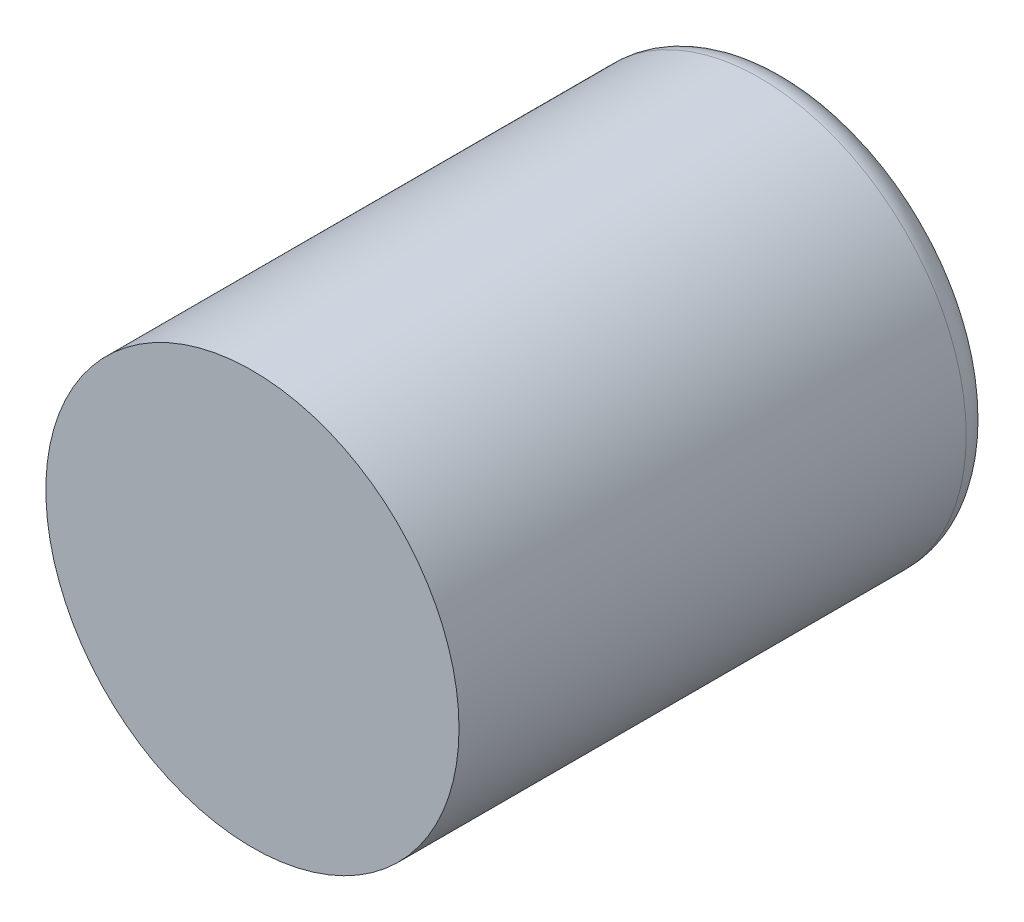
ISO-10303-21;
HEADER;
FILE_DESCRIPTION(('STEP AP214'),'2;1');
FILE_NAME('part.step','',(''),(''),'','','');
FILE_SCHEMA(('AUTOMOTIVE_DESIGN { 1 0 10303 214 1 1 1 1 }'));
ENDSEC;
DATA;
#1=APPLICATION_CONTEXT('core data for automotive mechanical design processes');
#2=APPLICATION_PROTOCOL_DEFINITION('international standard','automotive_design',2000,#1);
#3=PRODUCT_CONTEXT('',#1,'mechanical');
#4=PRODUCT('Part','Part','',(#3));
#5=PRODUCT_RELATED_PRODUCT_CATEGORY('part','',(#4));
#6=PRODUCT_DEFINITION_FORMATION('','',#4);
#7=PRODUCT_DEFINITION_CONTEXT('part definition',#1,'design');
#8=PRODUCT_DEFINITION('design','',#6,#7);
#9=PRODUCT_DEFINITION_SHAPE('','',#8);
#10=(LENGTH_UNIT() NAMED_UNIT(*) SI_UNIT(.MILLI.,.METRE.));
#11=(NAMED_UNIT(*) PLANE_ANGLE_UNIT() SI_UNIT($,.RADIAN.));
#12=(NAMED_UNIT(*) SI_UNIT($,.STERADIAN.) SOLID_ANGLE_UNIT());
#13=UNCERTAINTY_MEASURE_WITH_UNIT(LENGTH_MEASURE(1.E-05),#10,'distance_accuracy_value','');
#14=(GEOMETRIC_REPRESENTATION_CONTEXT(3) GLOBAL_UNCERTAINTY_ASSIGNED_CONTEXT((#13)) GLOBAL_UNIT_ASSIGNED_CONTEXT((#10,
#11,#12)) REPRESENTATION_CONTEXT('',''));
#15=CARTESIAN_POINT('',(0.,0.,0.));
#16=DIRECTION('',(0.,0.,1.));
#17=DIRECTION('',(1.,0.,0.));
#18=AXIS2_PLACEMENT_3D('',#15,#16,#17);
#19=CARTESIAN_POINT('',(0.,0.,0.2));
#20=DIRECTION('',(0.,0.,1.));
#21=DIRECTION('',(1.,0.,0.));
#22=AXIS2_PLACEMENT_3D('',#19,#20,#21);
#23=PLANE('',#22);
#24=CARTESIAN_POINT('',(0.,0.,0.2));
#25=DIRECTION('',(0.,0.,1.));
#26=DIRECTION('',(1.,0.,0.));
#27=AXIS2_PLACEMENT_3D('',#24,#25,#26);
#28=CIRCLE('',#27,6.25);
#29=CARTESIAN_POINT('',(6.25,0.,0.2));
#30=VERTEX_POINT('',#29);
#31=EDGE_CURVE('E27',#30,#30,#28,.T.);
#32=ORIENTED_EDGE('',*,*,#31,.F.);
#33=EDGE_LOOP('',(#32));
#34=FACE_BOUND('',#33,.T.);
#35=ADVANCED_FACE('F15',(#34),#23,.F.);
#36=CARTESIAN_POINT('',(0.,0.,19.));
#37=DIRECTION('',(0.,0.,1.));
#38=DIRECTION('',(1.,0.,0.));
#39=AXIS2_PLACEMENT_3D('',#36,#37,#38);
#40=PLANE('',#39);
#41=CARTESIAN_POINT('',(0.,0.,19.));
#42=DIRECTION('',(0.,0.,1.));
#43=DIRECTION('',(1.,0.,0.));
#44=AXIS2_PLACEMENT_3D('',#41,#42,#43);
#45=CIRCLE('',#44,7.25);
#46=CARTESIAN_POINT('',(7.25,0.,19.));
#47=VERTEX_POINT('',#46);
#48=EDGE_CURVE('E19',#47,#47,#45,.F.);
#49=ORIENTED_EDGE('',*,*,#48,.F.);
#50=EDGE_LOOP('',(#49));
#51=FACE_BOUND('',#50,.T.);
#52=ADVANCED_FACE('F39',(#51),#40,.T.);
#53=CARTESIAN_POINT('',(0.,0.,1.2));
#54=DIRECTION('',(0.,0.,-1.));
#55=DIRECTION('',(1.,0.,0.));
#56=AXIS2_PLACEMENT_3D('',#53,#54,#55);
#57=TOROIDAL_SURFACE('',#56,6.25,1.);
#58=CARTESIAN_POINT('',(0.,0.,1.2));
#59=DIRECTION('',(0.,0.,1.));
#60=DIRECTION('',(1.,0.,0.));
#61=AXIS2_PLACEMENT_3D('',#58,#59,#60);
#62=CIRCLE('',#61,7.25);
#63=CARTESIAN_POINT('',(7.25,0.,1.2));
#64=VERTEX_POINT('',#63);
#65=EDGE_CURVE('E10',#64,#64,#62,.T.);
#66=ORIENTED_EDGE('',*,*,#65,.F.);
#67=EDGE_LOOP('',(#66));
#68=FACE_BOUND('',#67,.T.);
#69=ORIENTED_EDGE('',*,*,#31,.T.);
#70=EDGE_LOOP('',(#69));
#71=FACE_BOUND('',#70,.T.);
#72=ADVANCED_FACE('F34',(#68,#71),#57,.T.);
#73=CARTESIAN_POINT('',(0.,0.,0.2));
#74=DIRECTION('',(0.,0.,1.));
#75=DIRECTION('',(1.,0.,0.));
#76=AXIS2_PLACEMENT_3D('',#73,#74,#75);
#77=CYLINDRICAL_SURFACE('',#76,7.25);
#78=ORIENTED_EDGE('',*,*,#48,.T.);
#79=EDGE_LOOP('',(#78));
#80=FACE_BOUND('',#79,.T.);
#81=ORIENTED_EDGE('',*,*,#65,.T.);
#82=EDGE_LOOP('',(#81));
#83=FACE_BOUND('',#82,.T.);
#84=ADVANCED_FACE('F38',(#80,#83),#77,.T.);
#85=CLOSED_SHELL('',(#35,#52,#72,#84));
#86=MANIFOLD_SOLID_BREP('B1',#85);
#87=ADVANCED_BREP_SHAPE_REPRESENTATION('',(#18,#86),#14);
#88=SHAPE_DEFINITION_REPRESENTATION(#9,#87);
ENDSEC;
END-ISO-10303-21;
